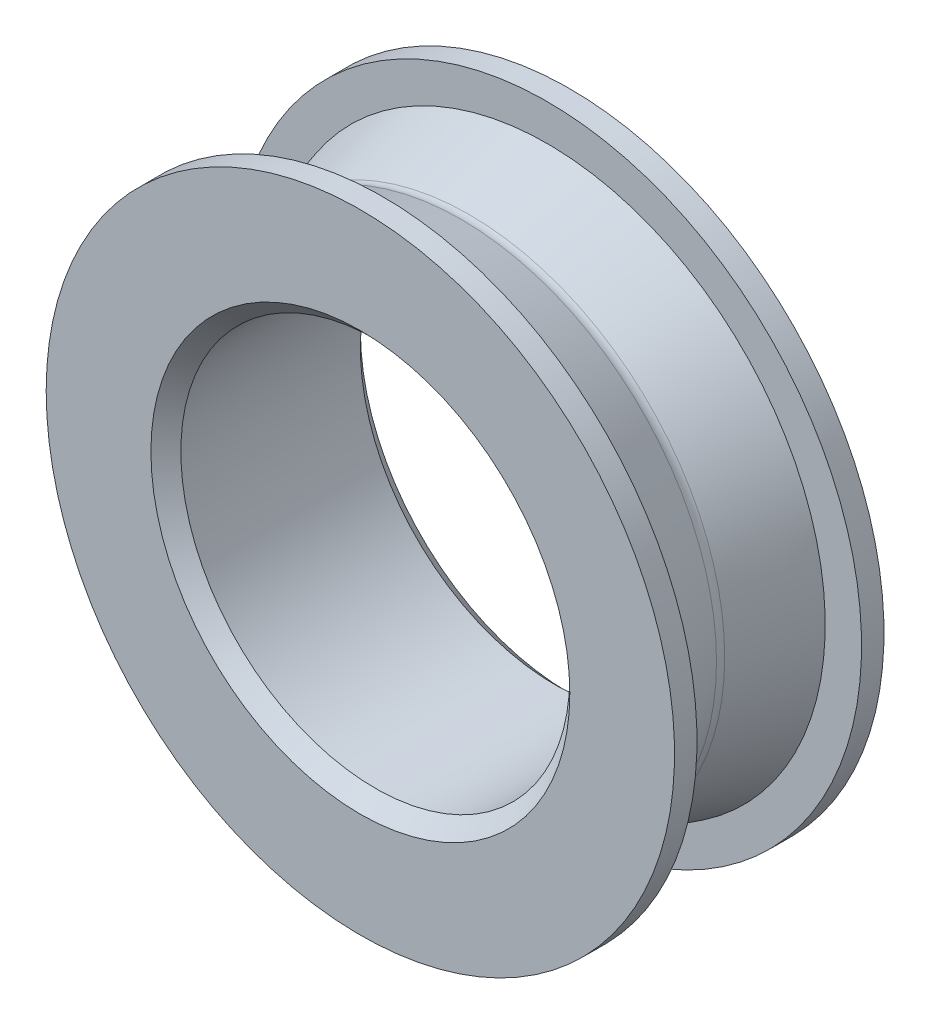
ISO-10303-21;
HEADER;
FILE_DESCRIPTION(('STEP AP214'),'2;1');
FILE_NAME('part.step','',(''),(''),'','','');
FILE_SCHEMA(('AUTOMOTIVE_DESIGN { 1 0 10303 214 1 1 1 1 }'));
ENDSEC;
DATA;
#1=APPLICATION_CONTEXT('core data for automotive mechanical design processes');
#2=APPLICATION_PROTOCOL_DEFINITION('international standard','automotive_design',2000,#1);
#3=PRODUCT_CONTEXT('',#1,'mechanical');
#4=PRODUCT('Part','Part','',(#3));
#5=PRODUCT_RELATED_PRODUCT_CATEGORY('part','',(#4));
#6=PRODUCT_DEFINITION_FORMATION('','',#4);
#7=PRODUCT_DEFINITION_CONTEXT('part definition',#1,'design');
#8=PRODUCT_DEFINITION('design','',#6,#7);
#9=PRODUCT_DEFINITION_SHAPE('','',#8);
#10=(LENGTH_UNIT() NAMED_UNIT(*) SI_UNIT(.MILLI.,.METRE.));
#11=(NAMED_UNIT(*) PLANE_ANGLE_UNIT() SI_UNIT($,.RADIAN.));
#12=(NAMED_UNIT(*) SI_UNIT($,.STERADIAN.) SOLID_ANGLE_UNIT());
#13=UNCERTAINTY_MEASURE_WITH_UNIT(LENGTH_MEASURE(1.E-05),#10,'distance_accuracy_value','');
#14=(GEOMETRIC_REPRESENTATION_CONTEXT(3) GLOBAL_UNCERTAINTY_ASSIGNED_CONTEXT((#13)) GLOBAL_UNIT_ASSIGNED_CONTEXT((#10,
#11,#12)) REPRESENTATION_CONTEXT('',''));
#15=CARTESIAN_POINT('',(0.,0.,0.));
#16=DIRECTION('',(0.,0.,1.));
#17=DIRECTION('',(1.,0.,0.));
#18=AXIS2_PLACEMENT_3D('',#15,#16,#17);
#19=CARTESIAN_POINT('',(0.,0.,14.));
#20=DIRECTION('',(0.,0.,1.));
#21=DIRECTION('',(1.,0.,0.));
#22=AXIS2_PLACEMENT_3D('',#19,#20,#21);
#23=CONICAL_SURFACE('',#22,19.,0.278299659005112);
#24=CARTESIAN_POINT('',(0.,0.,7.27472112789738));
#25=DIRECTION('',(0.,0.,1.));
#26=DIRECTION('',(1.,0.,0.));
#27=AXIS2_PLACEMENT_3D('',#24,#25,#26);
#28=CIRCLE('',#27,17.0784917508278);
#29=CARTESIAN_POINT('',(17.0784917508278,0.,7.27472112789738));
#30=VERTEX_POINT('',#29);
#31=EDGE_CURVE('E59',#30,#30,#28,.T.);
#32=ORIENTED_EDGE('',*,*,#31,.T.);
#33=EDGE_LOOP('',(#32));
#34=FACE_BOUND('',#33,.T.);
#35=CARTESIAN_POINT('',(0.,0.,12.5));
#36=DIRECTION('',(0.,0.,1.));
#37=DIRECTION('',(1.,0.,0.));
#38=AXIS2_PLACEMENT_3D('',#35,#36,#37);
#39=CIRCLE('',#38,18.5714285714286);
#40=CARTESIAN_POINT('',(18.5714285714286,0.,12.5));
#41=VERTEX_POINT('',#40);
#42=EDGE_CURVE('E65',#41,#41,#39,.T.);
#43=ORIENTED_EDGE('',*,*,#42,.F.);
#44=EDGE_LOOP('',(#43));
#45=FACE_BOUND('',#44,.T.);
#46=ADVANCED_FACE('F38',(#34,#45),#23,.T.);
#47=CARTESIAN_POINT('',(0.,0.,7.));
#48=DIRECTION('',(0.,0.,-1.));
#49=DIRECTION('',(-1.,0.,0.));
#50=AXIS2_PLACEMENT_3D('',#47,#48,#49);
#51=CONICAL_SURFACE('',#50,17.,0.278299659005112);
#52=CARTESIAN_POINT('',(0.,0.,6.72527887210262));
#53=DIRECTION('',(0.,0.,-1.));
#54=DIRECTION('',(-1.,0.,0.));
#55=AXIS2_PLACEMENT_3D('',#52,#53,#54);
#56=CIRCLE('',#55,17.0784917508278);
#57=CARTESIAN_POINT('',(-17.0784917508278,0.,6.72527887210262));
#58=VERTEX_POINT('',#57);
#59=EDGE_CURVE('E62',#58,#58,#56,.T.);
#60=ORIENTED_EDGE('',*,*,#59,.T.);
#61=EDGE_LOOP('',(#60));
#62=FACE_BOUND('',#61,.T.);
#63=CARTESIAN_POINT('',(0.,0.,1.5));
#64=DIRECTION('',(0.,0.,-1.));
#65=DIRECTION('',(-1.,0.,0.));
#66=AXIS2_PLACEMENT_3D('',#63,#64,#65);
#67=CIRCLE('',#66,18.5714285714286);
#68=CARTESIAN_POINT('',(-18.5714285714286,0.,1.5));
#69=VERTEX_POINT('',#68);
#70=EDGE_CURVE('E68',#69,#69,#67,.T.);
#71=ORIENTED_EDGE('',*,*,#70,.F.);
#72=EDGE_LOOP('',(#71));
#73=FACE_BOUND('',#72,.T.);
#74=ADVANCED_FACE('F96',(#62,#73),#51,.T.);
#75=CARTESIAN_POINT('',(0.,0.,14.));
#76=DIRECTION('',(0.,0.,1.));
#77=DIRECTION('',(1.,0.,0.));
#78=AXIS2_PLACEMENT_3D('',#75,#76,#77);
#79=PLANE('',#78);
#80=CARTESIAN_POINT('',(0.,0.,14.));
#81=DIRECTION('',(0.,0.,1.));
#82=DIRECTION('',(1.,0.,0.));
#83=AXIS2_PLACEMENT_3D('',#80,#81,#82);
#84=CIRCLE('',#83,14.);
#85=CARTESIAN_POINT('',(14.,0.,14.));
#86=VERTEX_POINT('',#85);
#87=EDGE_CURVE('E10',#86,#86,#84,.F.);
#88=ORIENTED_EDGE('',*,*,#87,.T.);
#89=EDGE_LOOP('',(#88));
#90=FACE_BOUND('',#89,.T.);
#91=CARTESIAN_POINT('',(0.,0.,14.));
#92=DIRECTION('',(0.,0.,-1.));
#93=DIRECTION('',(-1.,0.,0.));
#94=AXIS2_PLACEMENT_3D('',#91,#92,#93);
#95=CIRCLE('',#94,21.);
#96=CARTESIAN_POINT('',(-21.,0.,14.));
#97=VERTEX_POINT('',#96);
#98=EDGE_CURVE('E78',#97,#97,#95,.T.);
#99=ORIENTED_EDGE('',*,*,#98,.F.);
#100=EDGE_LOOP('',(#99));
#101=FACE_BOUND('',#100,.T.);
#102=ADVANCED_FACE('F93',(#90,#101),#79,.T.);
#103=CARTESIAN_POINT('',(0.,0.,0.));
#104=DIRECTION('',(0.,0.,1.));
#105=DIRECTION('',(1.,0.,0.));
#106=AXIS2_PLACEMENT_3D('',#103,#104,#105);
#107=PLANE('',#106);
#108=CARTESIAN_POINT('',(0.,0.,0.));
#109=DIRECTION('',(0.,0.,1.));
#110=DIRECTION('',(1.,0.,0.));
#111=AXIS2_PLACEMENT_3D('',#108,#109,#110);
#112=CIRCLE('',#111,14.);
#113=CARTESIAN_POINT('',(14.,0.,0.));
#114=VERTEX_POINT('',#113);
#115=EDGE_CURVE('E54',#114,#114,#112,.T.);
#116=ORIENTED_EDGE('',*,*,#115,.T.);
#117=EDGE_LOOP('',(#116));
#118=FACE_BOUND('',#117,.T.);
#119=CARTESIAN_POINT('',(0.,0.,0.));
#120=DIRECTION('',(0.,0.,-1.));
#121=DIRECTION('',(-1.,0.,0.));
#122=AXIS2_PLACEMENT_3D('',#119,#120,#121);
#123=CIRCLE('',#122,21.);
#124=CARTESIAN_POINT('',(-21.,0.,0.));
#125=VERTEX_POINT('',#124);
#126=EDGE_CURVE('E72',#125,#125,#123,.T.);
#127=ORIENTED_EDGE('',*,*,#126,.T.);
#128=EDGE_LOOP('',(#127));
#129=FACE_BOUND('',#128,.T.);
#130=ADVANCED_FACE('F95',(#118,#129),#107,.F.);
#131=CARTESIAN_POINT('',(0.,0.,14.));
#132=DIRECTION('',(0.,0.,-1.));
#133=DIRECTION('',(-1.,0.,0.));
#134=AXIS2_PLACEMENT_3D('',#131,#132,#133);
#135=CYLINDRICAL_SURFACE('',#134,13.);
#136=CARTESIAN_POINT('',(0.,0.,1.00000000000001));
#137=DIRECTION('',(0.,0.,1.));
#138=DIRECTION('',(1.,0.,0.));
#139=AXIS2_PLACEMENT_3D('',#136,#137,#138);
#140=CIRCLE('',#139,13.);
#141=CARTESIAN_POINT('',(13.,0.,1.00000000000001));
#142=VERTEX_POINT('',#141);
#143=EDGE_CURVE('E46',#142,#142,#140,.F.);
#144=ORIENTED_EDGE('',*,*,#143,.T.);
#145=EDGE_LOOP('',(#144));
#146=FACE_BOUND('',#145,.T.);
#147=CARTESIAN_POINT('',(0.,0.,13.));
#148=DIRECTION('',(0.,0.,1.));
#149=DIRECTION('',(1.,0.,0.));
#150=AXIS2_PLACEMENT_3D('',#147,#148,#149);
#151=CIRCLE('',#150,13.);
#152=CARTESIAN_POINT('',(13.,0.,13.));
#153=VERTEX_POINT('',#152);
#154=EDGE_CURVE('E50',#153,#153,#151,.T.);
#155=ORIENTED_EDGE('',*,*,#154,.T.);
#156=EDGE_LOOP('',(#155));
#157=FACE_BOUND('',#156,.T.);
#158=ADVANCED_FACE('F102',(#146,#157),#135,.F.);
#159=CARTESIAN_POINT('',(0.,0.,1.5));
#160=DIRECTION('',(0.,0.,-1.));
#161=DIRECTION('',(-1.,0.,0.));
#162=AXIS2_PLACEMENT_3D('',#159,#160,#161);
#163=CYLINDRICAL_SURFACE('',#162,21.);
#164=CARTESIAN_POINT('',(0.,0.,1.5));
#165=DIRECTION('',(0.,0.,-1.));
#166=DIRECTION('',(-1.,0.,0.));
#167=AXIS2_PLACEMENT_3D('',#164,#165,#166);
#168=CIRCLE('',#167,21.);
#169=CARTESIAN_POINT('',(-21.,0.,1.5));
#170=VERTEX_POINT('',#169);
#171=EDGE_CURVE('E71',#170,#170,#168,.T.);
#172=ORIENTED_EDGE('',*,*,#171,.T.);
#173=EDGE_LOOP('',(#172));
#174=FACE_BOUND('',#173,.T.);
#175=ORIENTED_EDGE('',*,*,#126,.F.);
#176=EDGE_LOOP('',(#175));
#177=FACE_BOUND('',#176,.T.);
#178=ADVANCED_FACE('F115',(#174,#177),#163,.T.);
#179=CARTESIAN_POINT('',(0.,0.,1.5));
#180=DIRECTION('',(0.,0.,-1.));
#181=DIRECTION('',(-1.,0.,0.));
#182=AXIS2_PLACEMENT_3D('',#179,#180,#181);
#183=PLANE('',#182);
#184=ORIENTED_EDGE('',*,*,#70,.T.);
#185=EDGE_LOOP('',(#184));
#186=FACE_BOUND('',#185,.T.);
#187=ORIENTED_EDGE('',*,*,#171,.F.);
#188=EDGE_LOOP('',(#187));
#189=FACE_BOUND('',#188,.T.);
#190=ADVANCED_FACE('F121',(#186,#189),#183,.F.);
#191=CARTESIAN_POINT('',(0.,0.,12.5));
#192=DIRECTION('',(0.,0.,1.));
#193=DIRECTION('',(-1.,0.,0.));
#194=AXIS2_PLACEMENT_3D('',#191,#192,#193);
#195=PLANE('',#194);
#196=ORIENTED_EDGE('',*,*,#42,.T.);
#197=EDGE_LOOP('',(#196));
#198=FACE_BOUND('',#197,.T.);
#199=CARTESIAN_POINT('',(0.,0.,12.5));
#200=DIRECTION('',(0.,0.,-1.));
#201=DIRECTION('',(-1.,0.,0.));
#202=AXIS2_PLACEMENT_3D('',#199,#200,#201);
#203=CIRCLE('',#202,21.);
#204=CARTESIAN_POINT('',(-21.,0.,12.5));
#205=VERTEX_POINT('',#204);
#206=EDGE_CURVE('E75',#205,#205,#203,.T.);
#207=ORIENTED_EDGE('',*,*,#206,.T.);
#208=EDGE_LOOP('',(#207));
#209=FACE_BOUND('',#208,.T.);
#210=ADVANCED_FACE('F84',(#198,#209),#195,.F.);
#211=CARTESIAN_POINT('',(0.,0.,12.5));
#212=DIRECTION('',(0.,0.,1.));
#213=DIRECTION('',(1.,0.,0.));
#214=AXIS2_PLACEMENT_3D('',#211,#212,#213);
#215=CYLINDRICAL_SURFACE('',#214,21.);
#216=ORIENTED_EDGE('',*,*,#206,.F.);
#217=EDGE_LOOP('',(#216));
#218=FACE_BOUND('',#217,.T.);
#219=ORIENTED_EDGE('',*,*,#98,.T.);
#220=EDGE_LOOP('',(#219));
#221=FACE_BOUND('',#220,.T.);
#222=ADVANCED_FACE('F86',(#218,#221),#215,.T.);
#223=CARTESIAN_POINT('',(0.,0.,7.));
#224=DIRECTION('',(0.,0.,-1.));
#225=DIRECTION('',(-1.,0.,0.));
#226=AXIS2_PLACEMENT_3D('',#223,#224,#225);
#227=TOROIDAL_SURFACE('',#226,18.0400156984686,1.);
#228=ORIENTED_EDGE('',*,*,#31,.F.);
#229=EDGE_LOOP('',(#228));
#230=FACE_BOUND('',#229,.T.);
#231=ORIENTED_EDGE('',*,*,#59,.F.);
#232=EDGE_LOOP('',(#231));
#233=FACE_BOUND('',#232,.T.);
#234=ADVANCED_FACE('F89',(#230,#233),#227,.F.);
#235=CARTESIAN_POINT('',(0.,0.,0.));
#236=DIRECTION('',(0.,0.,-1.));
#237=DIRECTION('',(-1.,0.,0.));
#238=AXIS2_PLACEMENT_3D('',#235,#236,#237);
#239=CONICAL_SURFACE('',#238,14.,0.785398163397447);
#240=ORIENTED_EDGE('',*,*,#143,.F.);
#241=EDGE_LOOP('',(#240));
#242=FACE_BOUND('',#241,.T.);
#243=ORIENTED_EDGE('',*,*,#115,.F.);
#244=EDGE_LOOP('',(#243));
#245=FACE_BOUND('',#244,.T.);
#246=ADVANCED_FACE('F127',(#242,#245),#239,.F.);
#247=CARTESIAN_POINT('',(0.,0.,13.));
#248=DIRECTION('',(0.,0.,1.));
#249=DIRECTION('',(1.,0.,0.));
#250=AXIS2_PLACEMENT_3D('',#247,#248,#249);
#251=CONICAL_SURFACE('',#250,13.,0.785398163397451);
#252=ORIENTED_EDGE('',*,*,#87,.F.);
#253=EDGE_LOOP('',(#252));
#254=FACE_BOUND('',#253,.T.);
#255=ORIENTED_EDGE('',*,*,#154,.F.);
#256=EDGE_LOOP('',(#255));
#257=FACE_BOUND('',#256,.T.);
#258=ADVANCED_FACE('F41',(#254,#257),#251,.F.);
#259=CLOSED_SHELL('',(#46,#74,#102,#130,#158,#178,#190,#210,#222,#234,#246,#258));
#260=MANIFOLD_SOLID_BREP('B2',#259);
#261=ADVANCED_BREP_SHAPE_REPRESENTATION('',(#18,#260),#14);
#262=SHAPE_DEFINITION_REPRESENTATION(#9,#261);
ENDSEC;
END-ISO-10303-21;
